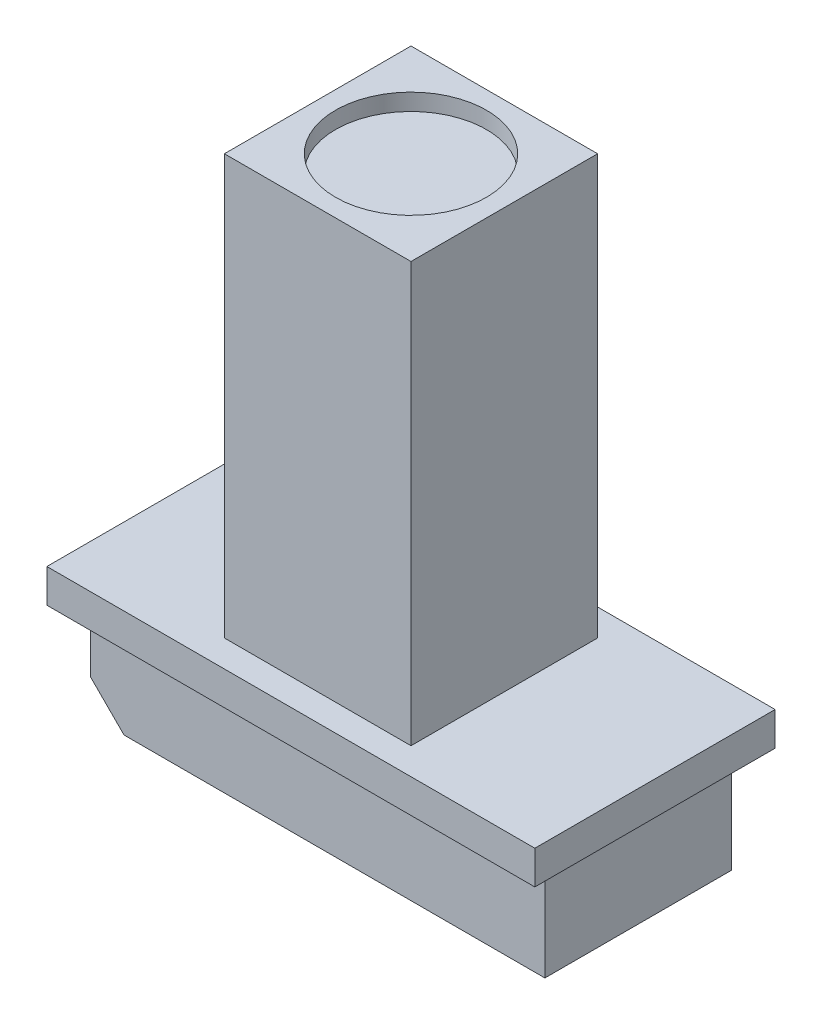
ISO-10303-21;
HEADER;
FILE_DESCRIPTION(('STEP AP214'),'2;1');
FILE_NAME('part.step','',(''),(''),'','','');
FILE_SCHEMA(('AUTOMOTIVE_DESIGN { 1 0 10303 214 1 1 1 1 }'));
ENDSEC;
DATA;
#1=APPLICATION_CONTEXT('core data for automotive mechanical design processes');
#2=APPLICATION_PROTOCOL_DEFINITION('international standard','automotive_design',2000,#1);
#3=PRODUCT_CONTEXT('',#1,'mechanical');
#4=PRODUCT('Part','Part','',(#3));
#5=PRODUCT_RELATED_PRODUCT_CATEGORY('part','',(#4));
#6=PRODUCT_DEFINITION_FORMATION('','',#4);
#7=PRODUCT_DEFINITION_CONTEXT('part definition',#1,'design');
#8=PRODUCT_DEFINITION('design','',#6,#7);
#9=PRODUCT_DEFINITION_SHAPE('','',#8);
#10=(LENGTH_UNIT() NAMED_UNIT(*) SI_UNIT(.MILLI.,.METRE.));
#11=(NAMED_UNIT(*) PLANE_ANGLE_UNIT() SI_UNIT($,.RADIAN.));
#12=(NAMED_UNIT(*) SI_UNIT($,.STERADIAN.) SOLID_ANGLE_UNIT());
#13=UNCERTAINTY_MEASURE_WITH_UNIT(LENGTH_MEASURE(1.E-05),#10,'distance_accuracy_value','');
#14=(GEOMETRIC_REPRESENTATION_CONTEXT(3) GLOBAL_UNCERTAINTY_ASSIGNED_CONTEXT((#13)) GLOBAL_UNIT_ASSIGNED_CONTEXT((#10,
#11,#12)) REPRESENTATION_CONTEXT('',''));
#15=CARTESIAN_POINT('',(0.,0.,0.));
#16=DIRECTION('',(0.,0.,1.));
#17=DIRECTION('',(1.,0.,0.));
#18=AXIS2_PLACEMENT_3D('',#15,#16,#17);
#19=CARTESIAN_POINT('',(-7.27198708871191,-1.,-3.58102301823648));
#20=DIRECTION('',(1.,0.,0.));
#21=DIRECTION('',(0.,0.,-1.));
#22=AXIS2_PLACEMENT_3D('',#19,#20,#21);
#23=PLANE('',#22);
#24=DIRECTION('',(0.,0.,-1.));
#25=VECTOR('',#24,1.);
#26=CARTESIAN_POINT('',(-7.27198708871191,0.,-3.58102301823648));
#27=LINE('',#26,#25);
#28=CARTESIAN_POINT('',(-7.27198708871191,0.,3.58102301823649));
#29=VERTEX_POINT('',#28);
#30=CARTESIAN_POINT('',(-7.27198708871191,0.,-3.58102301823648));
#31=VERTEX_POINT('',#30);
#32=EDGE_CURVE('E151',#29,#31,#27,.T.);
#33=ORIENTED_EDGE('',*,*,#32,.T.);
#34=DIRECTION('',(0.,1.,0.));
#35=VECTOR('',#34,1.);
#36=CARTESIAN_POINT('',(-7.27198708871191,-1.,-3.58102301823648));
#37=LINE('',#36,#35);
#38=CARTESIAN_POINT('',(-7.27198708871191,-1.,-3.58102301823648));
#39=VERTEX_POINT('',#38);
#40=EDGE_CURVE('E178',#39,#31,#37,.T.);
#41=ORIENTED_EDGE('',*,*,#40,.F.);
#42=DIRECTION('',(0.,0.,-1.));
#43=VECTOR('',#42,1.);
#44=CARTESIAN_POINT('',(-7.27198708871191,-1.,-3.58102301823648));
#45=LINE('',#44,#43);
#46=CARTESIAN_POINT('',(-7.27198708871191,-1.,3.58102301823649));
#47=VERTEX_POINT('',#46);
#48=EDGE_CURVE('E152',#47,#39,#45,.T.);
#49=ORIENTED_EDGE('',*,*,#48,.F.);
#50=DIRECTION('',(0.,1.,0.));
#51=VECTOR('',#50,1.);
#52=CARTESIAN_POINT('',(-7.27198708871191,-1.,3.58102301823649));
#53=LINE('',#52,#51);
#54=EDGE_CURVE('E162',#47,#29,#53,.T.);
#55=ORIENTED_EDGE('',*,*,#54,.T.);
#56=EDGE_LOOP('',(#33,#41,#49,#55));
#57=FACE_BOUND('',#56,.T.);
#58=ADVANCED_FACE('F42',(#57),#23,.F.);
#59=CARTESIAN_POINT('',(7.27198708871191,-1.,-3.58102301823648));
#60=DIRECTION('',(0.,0.,1.));
#61=DIRECTION('',(1.,0.,0.));
#62=AXIS2_PLACEMENT_3D('',#59,#60,#61);
#63=PLANE('',#62);
#64=DIRECTION('',(1.,0.,0.));
#65=VECTOR('',#64,1.);
#66=CARTESIAN_POINT('',(7.27198708871191,0.,-3.58102301823648));
#67=LINE('',#66,#65);
#68=CARTESIAN_POINT('',(7.27198708871191,0.,-3.58102301823648));
#69=VERTEX_POINT('',#68);
#70=EDGE_CURVE('E165',#31,#69,#67,.T.);
#71=ORIENTED_EDGE('',*,*,#70,.T.);
#72=DIRECTION('',(0.,1.,0.));
#73=VECTOR('',#72,1.);
#74=CARTESIAN_POINT('',(7.27198708871191,-1.,-3.58102301823648));
#75=LINE('',#74,#73);
#76=CARTESIAN_POINT('',(7.27198708871191,-1.,-3.58102301823648));
#77=VERTEX_POINT('',#76);
#78=EDGE_CURVE('E175',#77,#69,#75,.T.);
#79=ORIENTED_EDGE('',*,*,#78,.F.);
#80=DIRECTION('',(1.,0.,0.));
#81=VECTOR('',#80,1.);
#82=CARTESIAN_POINT('',(7.27198708871191,-1.,-3.58102301823648));
#83=LINE('',#82,#81);
#84=EDGE_CURVE('E155',#39,#77,#83,.T.);
#85=ORIENTED_EDGE('',*,*,#84,.F.);
#86=ORIENTED_EDGE('',*,*,#40,.T.);
#87=EDGE_LOOP('',(#71,#79,#85,#86));
#88=FACE_BOUND('',#87,.T.);
#89=ADVANCED_FACE('F184',(#88),#63,.F.);
#90=CARTESIAN_POINT('',(7.27198708871191,-1.,-3.58102301823648));
#91=DIRECTION('',(-1.,0.,0.));
#92=DIRECTION('',(0.,0.,1.));
#93=AXIS2_PLACEMENT_3D('',#90,#91,#92);
#94=PLANE('',#93);
#95=DIRECTION('',(0.,0.,1.));
#96=VECTOR('',#95,1.);
#97=CARTESIAN_POINT('',(7.27198708871191,0.,-3.58102301823648));
#98=LINE('',#97,#96);
#99=CARTESIAN_POINT('',(7.27198708871191,0.,3.58102301823649));
#100=VERTEX_POINT('',#99);
#101=EDGE_CURVE('E167',#69,#100,#98,.T.);
#102=ORIENTED_EDGE('',*,*,#101,.T.);
#103=DIRECTION('',(0.,1.,0.));
#104=VECTOR('',#103,1.);
#105=CARTESIAN_POINT('',(7.27198708871191,-1.,3.58102301823649));
#106=LINE('',#105,#104);
#107=CARTESIAN_POINT('',(7.27198708871191,-1.,3.58102301823649));
#108=VERTEX_POINT('',#107);
#109=EDGE_CURVE('E172',#108,#100,#106,.T.);
#110=ORIENTED_EDGE('',*,*,#109,.F.);
#111=DIRECTION('',(0.,0.,1.));
#112=VECTOR('',#111,1.);
#113=CARTESIAN_POINT('',(7.27198708871191,-1.,-3.58102301823648));
#114=LINE('',#113,#112);
#115=EDGE_CURVE('E158',#77,#108,#114,.T.);
#116=ORIENTED_EDGE('',*,*,#115,.F.);
#117=ORIENTED_EDGE('',*,*,#78,.T.);
#118=EDGE_LOOP('',(#102,#110,#116,#117));
#119=FACE_BOUND('',#118,.T.);
#120=ADVANCED_FACE('F196',(#119),#94,.F.);
#121=CARTESIAN_POINT('',(7.27198708871191,-1.,3.58102301823649));
#122=DIRECTION('',(0.,0.,-1.));
#123=DIRECTION('',(-1.,0.,0.));
#124=AXIS2_PLACEMENT_3D('',#121,#122,#123);
#125=PLANE('',#124);
#126=DIRECTION('',(-1.,0.,0.));
#127=VECTOR('',#126,1.);
#128=CARTESIAN_POINT('',(7.27198708871191,0.,3.58102301823649));
#129=LINE('',#128,#127);
#130=EDGE_CURVE('E156',#100,#29,#129,.T.);
#131=ORIENTED_EDGE('',*,*,#130,.T.);
#132=ORIENTED_EDGE('',*,*,#54,.F.);
#133=DIRECTION('',(-1.,0.,0.));
#134=VECTOR('',#133,1.);
#135=CARTESIAN_POINT('',(7.27198708871191,-1.,3.58102301823649));
#136=LINE('',#135,#134);
#137=EDGE_CURVE('E160',#108,#47,#136,.T.);
#138=ORIENTED_EDGE('',*,*,#137,.F.);
#139=ORIENTED_EDGE('',*,*,#109,.T.);
#140=EDGE_LOOP('',(#131,#132,#138,#139));
#141=FACE_BOUND('',#140,.T.);
#142=ADVANCED_FACE('F200',(#141),#125,.F.);
#143=CARTESIAN_POINT('',(0.,-1.,0.));
#144=DIRECTION('',(0.,-1.,0.));
#145=DIRECTION('',(0.,0.,-1.));
#146=AXIS2_PLACEMENT_3D('',#143,#144,#145);
#147=PLANE('',#146);
#148=DIRECTION('',(0.,0.,-1.));
#149=VECTOR('',#148,1.);
#150=CARTESIAN_POINT('',(-6.77198708871191,-1.,-2.78102301823649));
#151=LINE('',#150,#149);
#152=CARTESIAN_POINT('',(-6.77198708871191,-1.,2.78102301823648));
#153=VERTEX_POINT('',#152);
#154=CARTESIAN_POINT('',(-6.77198708871191,-1.,-2.78102301823649));
#155=VERTEX_POINT('',#154);
#156=EDGE_CURVE('E140',#153,#155,#151,.T.);
#157=ORIENTED_EDGE('',*,*,#156,.F.);
#158=DIRECTION('',(-1.,0.,0.));
#159=VECTOR('',#158,1.);
#160=CARTESIAN_POINT('',(6.77198708871191,-1.,2.78102301823649));
#161=LINE('',#160,#159);
#162=CARTESIAN_POINT('',(6.77198708871191,-1.,2.78102301823649));
#163=VERTEX_POINT('',#162);
#164=EDGE_CURVE('E119',#163,#153,#161,.T.);
#165=ORIENTED_EDGE('',*,*,#164,.F.);
#166=DIRECTION('',(0.,0.,1.));
#167=VECTOR('',#166,1.);
#168=CARTESIAN_POINT('',(6.77198708871191,-1.,-2.78102301823649));
#169=LINE('',#168,#167);
#170=CARTESIAN_POINT('',(6.77198708871191,-1.,-2.78102301823649));
#171=VERTEX_POINT('',#170);
#172=EDGE_CURVE('E144',#171,#163,#169,.T.);
#173=ORIENTED_EDGE('',*,*,#172,.F.);
#174=DIRECTION('',(1.,0.,0.));
#175=VECTOR('',#174,1.);
#176=CARTESIAN_POINT('',(6.77198708871191,-1.,-2.78102301823649));
#177=LINE('',#176,#175);
#178=EDGE_CURVE('E126',#155,#171,#177,.T.);
#179=ORIENTED_EDGE('',*,*,#178,.F.);
#180=EDGE_LOOP('',(#157,#165,#173,#179));
#181=FACE_BOUND('',#180,.T.);
#182=ORIENTED_EDGE('',*,*,#48,.T.);
#183=ORIENTED_EDGE('',*,*,#84,.T.);
#184=ORIENTED_EDGE('',*,*,#115,.T.);
#185=ORIENTED_EDGE('',*,*,#137,.T.);
#186=EDGE_LOOP('',(#182,#183,#184,#185));
#187=FACE_BOUND('',#186,.T.);
#188=ADVANCED_FACE('F202',(#181,#187),#147,.T.);
#189=CARTESIAN_POINT('',(0.,0.,0.));
#190=DIRECTION('',(0.,-1.,0.));
#191=DIRECTION('',(0.,0.,-1.));
#192=AXIS2_PLACEMENT_3D('',#189,#190,#191);
#193=PLANE('',#192);
#194=ORIENTED_EDGE('',*,*,#32,.F.);
#195=ORIENTED_EDGE('',*,*,#130,.F.);
#196=ORIENTED_EDGE('',*,*,#101,.F.);
#197=ORIENTED_EDGE('',*,*,#70,.F.);
#198=EDGE_LOOP('',(#194,#195,#196,#197));
#199=FACE_BOUND('',#198,.T.);
#200=ADVANCED_FACE('F192',(#199),#193,.F.);
#201=CARTESIAN_POINT('',(-6.77198708871191,-4.,-2.78102301823649));
#202=DIRECTION('',(1.,0.,0.));
#203=DIRECTION('',(0.,0.,-1.));
#204=AXIS2_PLACEMENT_3D('',#201,#202,#203);
#205=PLANE('',#204);
#206=DIRECTION('',(0.,1.,0.));
#207=VECTOR('',#206,1.);
#208=CARTESIAN_POINT('',(-6.77198708871191,-4.,-2.78102301823649));
#209=LINE('',#208,#207);
#210=CARTESIAN_POINT('',(-6.77198708871191,-3.,-2.78102301823649));
#211=VERTEX_POINT('',#210);
#212=EDGE_CURVE('E129',#211,#155,#209,.T.);
#213=ORIENTED_EDGE('',*,*,#212,.F.);
#214=DIRECTION('',(0.,0.,1.));
#215=VECTOR('',#214,1.);
#216=CARTESIAN_POINT('',(-6.77198708871191,-3.,2.78102301823648));
#217=LINE('',#216,#215);
#218=CARTESIAN_POINT('',(-6.77198708871191,-3.,2.78102301823648));
#219=VERTEX_POINT('',#218);
#220=EDGE_CURVE('E50',#211,#219,#217,.T.);
#221=ORIENTED_EDGE('',*,*,#220,.T.);
#222=DIRECTION('',(0.,1.,0.));
#223=VECTOR('',#222,1.);
#224=CARTESIAN_POINT('',(-6.77198708871191,-4.,2.78102301823648));
#225=LINE('',#224,#223);
#226=EDGE_CURVE('E137',#219,#153,#225,.T.);
#227=ORIENTED_EDGE('',*,*,#226,.T.);
#228=ORIENTED_EDGE('',*,*,#156,.T.);
#229=EDGE_LOOP('',(#213,#221,#227,#228));
#230=FACE_BOUND('',#229,.T.);
#231=ADVANCED_FACE('F210',(#230),#205,.F.);
#232=CARTESIAN_POINT('',(6.77198708871191,-4.,-2.78102301823649));
#233=DIRECTION('',(0.,0.,1.));
#234=DIRECTION('',(1.,0.,0.));
#235=AXIS2_PLACEMENT_3D('',#232,#233,#234);
#236=PLANE('',#235);
#237=DIRECTION('',(1.,0.,0.));
#238=VECTOR('',#237,1.);
#239=CARTESIAN_POINT('',(6.77198708871191,-4.,-2.78102301823649));
#240=LINE('',#239,#238);
#241=CARTESIAN_POINT('',(-5.77198708871191,-4.,-2.78102301823649));
#242=VERTEX_POINT('',#241);
#243=CARTESIAN_POINT('',(6.77198708871191,-4.,-2.78102301823649));
#244=VERTEX_POINT('',#243);
#245=EDGE_CURVE('E110',#242,#244,#240,.T.);
#246=ORIENTED_EDGE('',*,*,#245,.F.);
#247=DIRECTION('',(-0.707106781186546,0.707106781186549,0.));
#248=VECTOR('',#247,1.);
#249=CARTESIAN_POINT('',(-5.77198708871191,-4.,-2.78102301823649));
#250=LINE('',#249,#248);
#251=EDGE_CURVE('E64',#242,#211,#250,.T.);
#252=ORIENTED_EDGE('',*,*,#251,.T.);
#253=ORIENTED_EDGE('',*,*,#212,.T.);
#254=ORIENTED_EDGE('',*,*,#178,.T.);
#255=DIRECTION('',(0.,1.,0.));
#256=VECTOR('',#255,1.);
#257=CARTESIAN_POINT('',(6.77198708871191,-4.,-2.78102301823649));
#258=LINE('',#257,#256);
#259=EDGE_CURVE('E123',#244,#171,#258,.T.);
#260=ORIENTED_EDGE('',*,*,#259,.F.);
#261=EDGE_LOOP('',(#246,#252,#253,#254,#260));
#262=FACE_BOUND('',#261,.T.);
#263=ADVANCED_FACE('F124',(#262),#236,.F.);
#264=CARTESIAN_POINT('',(6.77198708871191,-4.,-2.78102301823649));
#265=DIRECTION('',(-1.,0.,0.));
#266=DIRECTION('',(0.,0.,1.));
#267=AXIS2_PLACEMENT_3D('',#264,#265,#266);
#268=PLANE('',#267);
#269=ORIENTED_EDGE('',*,*,#172,.T.);
#270=DIRECTION('',(0.,1.,0.));
#271=VECTOR('',#270,1.);
#272=CARTESIAN_POINT('',(6.77198708871191,-4.,2.78102301823649));
#273=LINE('',#272,#271);
#274=CARTESIAN_POINT('',(6.77198708871191,-4.,2.78102301823649));
#275=VERTEX_POINT('',#274);
#276=EDGE_CURVE('E130',#275,#163,#273,.T.);
#277=ORIENTED_EDGE('',*,*,#276,.F.);
#278=DIRECTION('',(0.,0.,1.));
#279=VECTOR('',#278,1.);
#280=CARTESIAN_POINT('',(6.77198708871191,-4.,-2.78102301823649));
#281=LINE('',#280,#279);
#282=EDGE_CURVE('E115',#244,#275,#281,.T.);
#283=ORIENTED_EDGE('',*,*,#282,.F.);
#284=ORIENTED_EDGE('',*,*,#259,.T.);
#285=EDGE_LOOP('',(#269,#277,#283,#284));
#286=FACE_BOUND('',#285,.T.);
#287=ADVANCED_FACE('F132',(#286),#268,.F.);
#288=CARTESIAN_POINT('',(6.77198708871191,-4.,2.78102301823649));
#289=DIRECTION('',(0.,0.,-1.));
#290=DIRECTION('',(-1.,0.,0.));
#291=AXIS2_PLACEMENT_3D('',#288,#289,#290);
#292=PLANE('',#291);
#293=ORIENTED_EDGE('',*,*,#226,.F.);
#294=DIRECTION('',(0.707106781186546,-0.707106781186549,0.));
#295=VECTOR('',#294,1.);
#296=CARTESIAN_POINT('',(-5.77198708871191,-4.,2.78102301823648));
#297=LINE('',#296,#295);
#298=CARTESIAN_POINT('',(-5.77198708871191,-4.,2.78102301823648));
#299=VERTEX_POINT('',#298);
#300=EDGE_CURVE('E12',#219,#299,#297,.T.);
#301=ORIENTED_EDGE('',*,*,#300,.T.);
#302=DIRECTION('',(-1.,0.,0.));
#303=VECTOR('',#302,1.);
#304=CARTESIAN_POINT('',(6.77198708871191,-4.,2.78102301823649));
#305=LINE('',#304,#303);
#306=EDGE_CURVE('E135',#275,#299,#305,.T.);
#307=ORIENTED_EDGE('',*,*,#306,.F.);
#308=ORIENTED_EDGE('',*,*,#276,.T.);
#309=ORIENTED_EDGE('',*,*,#164,.T.);
#310=EDGE_LOOP('',(#293,#301,#307,#308,#309));
#311=FACE_BOUND('',#310,.T.);
#312=ADVANCED_FACE('F251',(#311),#292,.F.);
#313=CARTESIAN_POINT('',(0.,-4.,0.));
#314=DIRECTION('',(0.,-1.,0.));
#315=DIRECTION('',(0.,0.,-1.));
#316=AXIS2_PLACEMENT_3D('',#313,#314,#315);
#317=PLANE('',#316);
#318=ORIENTED_EDGE('',*,*,#306,.T.);
#319=DIRECTION('',(0.,0.,-1.));
#320=VECTOR('',#319,1.);
#321=CARTESIAN_POINT('',(-5.77198708871191,-4.,-2.78102301823649));
#322=LINE('',#321,#320);
#323=EDGE_CURVE('E118',#299,#242,#322,.T.);
#324=ORIENTED_EDGE('',*,*,#323,.T.);
#325=ORIENTED_EDGE('',*,*,#245,.T.);
#326=ORIENTED_EDGE('',*,*,#282,.T.);
#327=EDGE_LOOP('',(#318,#324,#325,#326));
#328=FACE_BOUND('',#327,.T.);
#329=ADVANCED_FACE('F113',(#328),#317,.T.);
#330=CARTESIAN_POINT('',(-5.77198708871191,-4.,0.));
#331=DIRECTION('',(-0.707106781186549,-0.707106781186546,0.));
#332=DIRECTION('',(0.,0.,1.));
#333=AXIS2_PLACEMENT_3D('',#330,#331,#332);
#334=PLANE('',#333);
#335=ORIENTED_EDGE('',*,*,#300,.F.);
#336=ORIENTED_EDGE('',*,*,#220,.F.);
#337=ORIENTED_EDGE('',*,*,#251,.F.);
#338=ORIENTED_EDGE('',*,*,#323,.F.);
#339=EDGE_LOOP('',(#335,#336,#337,#338));
#340=FACE_BOUND('',#339,.T.);
#341=ADVANCED_FACE('F44',(#340),#334,.T.);
#342=CLOSED_SHELL('',(#58,#89,#120,#142,#188,#200,#231,#263,#287,#312,#329,#341));
#343=MANIFOLD_SOLID_BREP('B2',#342);
#344=CARTESIAN_POINT('',(-2.78102301823649,12.5,2.78102301823648));
#345=DIRECTION('',(1.,0.,0.));
#346=DIRECTION('',(0.,0.,-1.));
#347=AXIS2_PLACEMENT_3D('',#344,#345,#346);
#348=PLANE('',#347);
#349=DIRECTION('',(0.,0.,1.));
#350=VECTOR('',#349,1.);
#351=CARTESIAN_POINT('',(-2.78102301823649,0.,2.78102301823648));
#352=LINE('',#351,#350);
#353=CARTESIAN_POINT('',(-2.78102301823649,0.,-2.78102301823649));
#354=VERTEX_POINT('',#353);
#355=CARTESIAN_POINT('',(-2.78102301823649,0.,2.78102301823648));
#356=VERTEX_POINT('',#355);
#357=EDGE_CURVE('E369',#354,#356,#352,.T.);
#358=ORIENTED_EDGE('',*,*,#357,.T.);
#359=DIRECTION('',(0.,-1.,0.));
#360=VECTOR('',#359,1.);
#361=CARTESIAN_POINT('',(-2.78102301823649,12.5,2.78102301823648));
#362=LINE('',#361,#360);
#363=CARTESIAN_POINT('',(-2.78102301823649,12.5,2.78102301823648));
#364=VERTEX_POINT('',#363);
#365=EDGE_CURVE('E40',#364,#356,#362,.T.);
#366=ORIENTED_EDGE('',*,*,#365,.F.);
#367=DIRECTION('',(0.,0.,1.));
#368=VECTOR('',#367,1.);
#369=CARTESIAN_POINT('',(-2.78102301823649,12.5,2.78102301823648));
#370=LINE('',#369,#368);
#371=CARTESIAN_POINT('',(-2.78102301823649,12.5,-2.78102301823649));
#372=VERTEX_POINT('',#371);
#373=EDGE_CURVE('E357',#372,#364,#370,.T.);
#374=ORIENTED_EDGE('',*,*,#373,.F.);
#375=DIRECTION('',(0.,-1.,0.));
#376=VECTOR('',#375,1.);
#377=CARTESIAN_POINT('',(-2.78102301823649,12.5,-2.78102301823649));
#378=LINE('',#377,#376);
#379=EDGE_CURVE('E365',#372,#354,#378,.T.);
#380=ORIENTED_EDGE('',*,*,#379,.T.);
#381=EDGE_LOOP('',(#358,#366,#374,#380));
#382=FACE_BOUND('',#381,.T.);
#383=ADVANCED_FACE('F306',(#382),#348,.F.);
#384=CARTESIAN_POINT('',(2.78102301823649,12.5,2.78102301823648));
#385=DIRECTION('',(0.,0.,-1.));
#386=DIRECTION('',(-1.,0.,0.));
#387=AXIS2_PLACEMENT_3D('',#384,#385,#386);
#388=PLANE('',#387);
#389=DIRECTION('',(1.,0.,0.));
#390=VECTOR('',#389,1.);
#391=CARTESIAN_POINT('',(2.78102301823649,0.,2.78102301823648));
#392=LINE('',#391,#390);
#393=CARTESIAN_POINT('',(2.78102301823649,0.,2.78102301823648));
#394=VERTEX_POINT('',#393);
#395=EDGE_CURVE('E361',#356,#394,#392,.T.);
#396=ORIENTED_EDGE('',*,*,#395,.T.);
#397=DIRECTION('',(0.,-1.,0.));
#398=VECTOR('',#397,1.);
#399=CARTESIAN_POINT('',(2.78102301823649,12.5,2.78102301823648));
#400=LINE('',#399,#398);
#401=CARTESIAN_POINT('',(2.78102301823649,12.5,2.78102301823648));
#402=VERTEX_POINT('',#401);
#403=EDGE_CURVE('E314',#402,#394,#400,.T.);
#404=ORIENTED_EDGE('',*,*,#403,.F.);
#405=DIRECTION('',(1.,0.,0.));
#406=VECTOR('',#405,1.);
#407=CARTESIAN_POINT('',(2.78102301823649,12.5,2.78102301823648));
#408=LINE('',#407,#406);
#409=EDGE_CURVE('E352',#364,#402,#408,.T.);
#410=ORIENTED_EDGE('',*,*,#409,.F.);
#411=ORIENTED_EDGE('',*,*,#365,.T.);
#412=EDGE_LOOP('',(#396,#404,#410,#411));
#413=FACE_BOUND('',#412,.T.);
#414=ADVANCED_FACE('F360',(#413),#388,.F.);
#415=CARTESIAN_POINT('',(2.78102301823649,12.5,2.78102301823648));
#416=DIRECTION('',(-1.,0.,0.));
#417=DIRECTION('',(0.,0.,1.));
#418=AXIS2_PLACEMENT_3D('',#415,#416,#417);
#419=PLANE('',#418);
#420=DIRECTION('',(0.,0.,-1.));
#421=VECTOR('',#420,1.);
#422=CARTESIAN_POINT('',(2.78102301823649,0.,2.78102301823648));
#423=LINE('',#422,#421);
#424=CARTESIAN_POINT('',(2.78102301823649,0.,-2.78102301823649));
#425=VERTEX_POINT('',#424);
#426=EDGE_CURVE('E339',#394,#425,#423,.T.);
#427=ORIENTED_EDGE('',*,*,#426,.T.);
#428=DIRECTION('',(0.,-1.,0.));
#429=VECTOR('',#428,1.);
#430=CARTESIAN_POINT('',(2.78102301823649,12.5,-2.78102301823649));
#431=LINE('',#430,#429);
#432=CARTESIAN_POINT('',(2.78102301823649,12.5,-2.78102301823649));
#433=VERTEX_POINT('',#432);
#434=EDGE_CURVE('E362',#433,#425,#431,.T.);
#435=ORIENTED_EDGE('',*,*,#434,.F.);
#436=DIRECTION('',(0.,0.,-1.));
#437=VECTOR('',#436,1.);
#438=CARTESIAN_POINT('',(2.78102301823649,12.5,2.78102301823648));
#439=LINE('',#438,#437);
#440=EDGE_CURVE('E355',#402,#433,#439,.T.);
#441=ORIENTED_EDGE('',*,*,#440,.F.);
#442=ORIENTED_EDGE('',*,*,#403,.T.);
#443=EDGE_LOOP('',(#427,#435,#441,#442));
#444=FACE_BOUND('',#443,.T.);
#445=ADVANCED_FACE('F363',(#444),#419,.F.);
#446=CARTESIAN_POINT('',(2.78102301823649,12.5,-2.78102301823649));
#447=DIRECTION('',(0.,0.,1.));
#448=DIRECTION('',(1.,0.,0.));
#449=AXIS2_PLACEMENT_3D('',#446,#447,#448);
#450=PLANE('',#449);
#451=DIRECTION('',(-1.,0.,0.));
#452=VECTOR('',#451,1.);
#453=CARTESIAN_POINT('',(2.78102301823649,0.,-2.78102301823649));
#454=LINE('',#453,#452);
#455=EDGE_CURVE('E345',#425,#354,#454,.T.);
#456=ORIENTED_EDGE('',*,*,#455,.T.);
#457=ORIENTED_EDGE('',*,*,#379,.F.);
#458=DIRECTION('',(-1.,0.,0.));
#459=VECTOR('',#458,1.);
#460=CARTESIAN_POINT('',(2.78102301823649,12.5,-2.78102301823649));
#461=LINE('',#460,#459);
#462=EDGE_CURVE('E322',#433,#372,#461,.T.);
#463=ORIENTED_EDGE('',*,*,#462,.F.);
#464=ORIENTED_EDGE('',*,*,#434,.T.);
#465=EDGE_LOOP('',(#456,#457,#463,#464));
#466=FACE_BOUND('',#465,.T.);
#467=ADVANCED_FACE('F377',(#466),#450,.F.);
#468=CARTESIAN_POINT('',(0.,12.5,0.));
#469=DIRECTION('',(0.,1.,0.));
#470=DIRECTION('',(0.,0.,1.));
#471=AXIS2_PLACEMENT_3D('',#468,#469,#470);
#472=PLANE('',#471);
#473=CARTESIAN_POINT('',(0.,12.5,0.));
#474=DIRECTION('',(0.,1.,0.));
#475=DIRECTION('',(0.,0.,1.));
#476=AXIS2_PLACEMENT_3D('',#473,#474,#475);
#477=CIRCLE('',#476,2.25);
#478=CARTESIAN_POINT('',(0.,12.5,2.25));
#479=VERTEX_POINT('',#478);
#480=EDGE_CURVE('E383',#479,#479,#477,.T.);
#481=ORIENTED_EDGE('',*,*,#480,.F.);
#482=EDGE_LOOP('',(#481));
#483=FACE_BOUND('',#482,.T.);
#484=ORIENTED_EDGE('',*,*,#373,.T.);
#485=ORIENTED_EDGE('',*,*,#409,.T.);
#486=ORIENTED_EDGE('',*,*,#440,.T.);
#487=ORIENTED_EDGE('',*,*,#462,.T.);
#488=EDGE_LOOP('',(#484,#485,#486,#487));
#489=FACE_BOUND('',#488,.T.);
#490=ADVANCED_FACE('F353',(#483,#489),#472,.T.);
#491=CARTESIAN_POINT('',(0.,0.,0.));
#492=DIRECTION('',(0.,1.,0.));
#493=DIRECTION('',(0.,0.,1.));
#494=AXIS2_PLACEMENT_3D('',#491,#492,#493);
#495=PLANE('',#494);
#496=ORIENTED_EDGE('',*,*,#357,.F.);
#497=ORIENTED_EDGE('',*,*,#455,.F.);
#498=ORIENTED_EDGE('',*,*,#426,.F.);
#499=ORIENTED_EDGE('',*,*,#395,.F.);
#500=EDGE_LOOP('',(#496,#497,#498,#499));
#501=FACE_BOUND('',#500,.T.);
#502=ADVANCED_FACE('F380',(#501),#495,.F.);
#503=CARTESIAN_POINT('',(0.,12.,0.));
#504=DIRECTION('',(0.,1.,0.));
#505=DIRECTION('',(0.,0.,1.));
#506=AXIS2_PLACEMENT_3D('',#503,#504,#505);
#507=CYLINDRICAL_SURFACE('',#506,2.25);
#508=CARTESIAN_POINT('',(0.,12.,0.));
#509=DIRECTION('',(0.,1.,0.));
#510=DIRECTION('',(0.,0.,1.));
#511=AXIS2_PLACEMENT_3D('',#508,#509,#510);
#512=CIRCLE('',#511,2.25);
#513=CARTESIAN_POINT('',(0.,12.,2.25));
#514=VERTEX_POINT('',#513);
#515=EDGE_CURVE('E372',#514,#514,#512,.T.);
#516=ORIENTED_EDGE('',*,*,#515,.F.);
#517=EDGE_LOOP('',(#516));
#518=FACE_BOUND('',#517,.T.);
#519=ORIENTED_EDGE('',*,*,#480,.T.);
#520=EDGE_LOOP('',(#519));
#521=FACE_BOUND('',#520,.T.);
#522=ADVANCED_FACE('F391',(#518,#521),#507,.F.);
#523=CARTESIAN_POINT('',(0.,12.,0.));
#524=DIRECTION('',(0.,1.,0.));
#525=DIRECTION('',(0.,0.,1.));
#526=AXIS2_PLACEMENT_3D('',#523,#524,#525);
#527=PLANE('',#526);
#528=ORIENTED_EDGE('',*,*,#515,.T.);
#529=EDGE_LOOP('',(#528));
#530=FACE_BOUND('',#529,.T.);
#531=ADVANCED_FACE('F389',(#530),#527,.T.);
#532=CLOSED_SHELL('',(#383,#414,#445,#467,#490,#502,#522,#531));
#533=MANIFOLD_SOLID_BREP('B6',#532);
#534=ADVANCED_BREP_SHAPE_REPRESENTATION('',(#18,#343,#533),#14);
#535=SHAPE_DEFINITION_REPRESENTATION(#9,#534);
ENDSEC;
END-ISO-10303-21;
